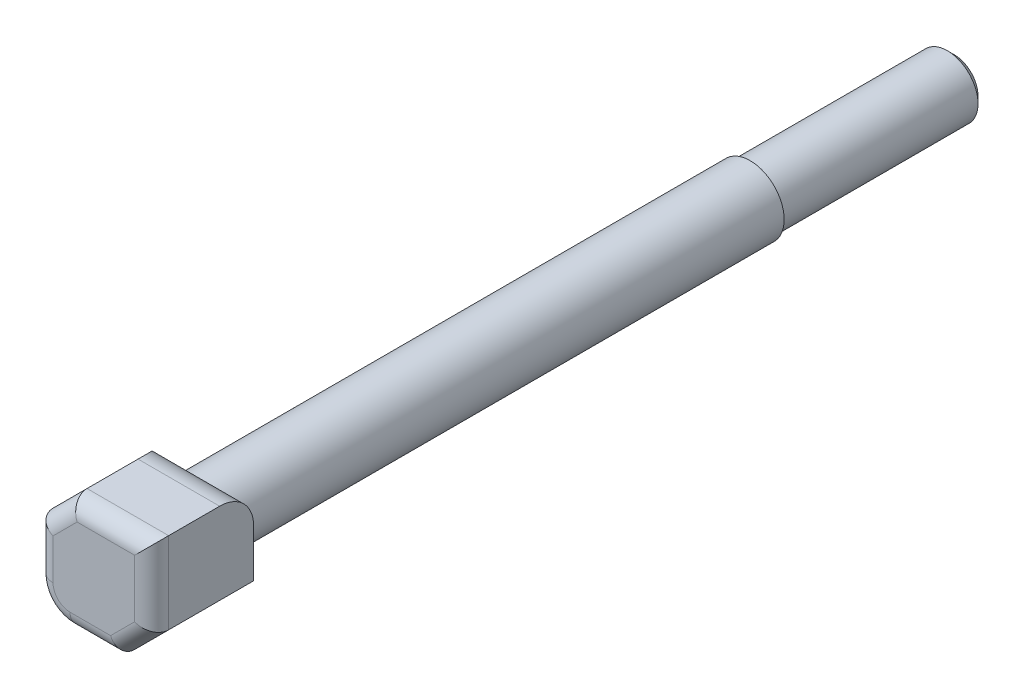
ISO-10303-21;
HEADER;
FILE_DESCRIPTION(('STEP AP214'),'2;1');
FILE_NAME('part.step','',(''),(''),'','','');
FILE_SCHEMA(('AUTOMOTIVE_DESIGN { 1 0 10303 214 1 1 1 1 }'));
ENDSEC;
DATA;
#1=APPLICATION_CONTEXT('core data for automotive mechanical design processes');
#2=APPLICATION_PROTOCOL_DEFINITION('international standard','automotive_design',2000,#1);
#3=PRODUCT_CONTEXT('',#1,'mechanical');
#4=PRODUCT('Part','Part','',(#3));
#5=PRODUCT_RELATED_PRODUCT_CATEGORY('part','',(#4));
#6=PRODUCT_DEFINITION_FORMATION('','',#4);
#7=PRODUCT_DEFINITION_CONTEXT('part definition',#1,'design');
#8=PRODUCT_DEFINITION('design','',#6,#7);
#9=PRODUCT_DEFINITION_SHAPE('','',#8);
#10=(LENGTH_UNIT() NAMED_UNIT(*) SI_UNIT(.MILLI.,.METRE.));
#11=(NAMED_UNIT(*) PLANE_ANGLE_UNIT() SI_UNIT($,.RADIAN.));
#12=(NAMED_UNIT(*) SI_UNIT($,.STERADIAN.) SOLID_ANGLE_UNIT());
#13=UNCERTAINTY_MEASURE_WITH_UNIT(LENGTH_MEASURE(1.E-05),#10,'distance_accuracy_value','');
#14=(GEOMETRIC_REPRESENTATION_CONTEXT(3) GLOBAL_UNCERTAINTY_ASSIGNED_CONTEXT((#13)) GLOBAL_UNIT_ASSIGNED_CONTEXT((#10,
#11,#12)) REPRESENTATION_CONTEXT('',''));
#15=CARTESIAN_POINT('',(0.,0.,0.));
#16=DIRECTION('',(0.,0.,1.));
#17=DIRECTION('',(1.,0.,0.));
#18=AXIS2_PLACEMENT_3D('',#15,#16,#17);
#19=CARTESIAN_POINT('',(2.551290276372,1.9,2.5));
#20=DIRECTION('',(-1.,0.,0.));
#21=DIRECTION('',(0.,0.,1.));
#22=AXIS2_PLACEMENT_3D('',#19,#20,#21);
#23=CYLINDRICAL_SURFACE('',#22,0.5);
#24=CARTESIAN_POINT('',(1.9,1.9,2.5));
#25=DIRECTION('',(-0.707106781186547,0.707106781186547,0.));
#26=DIRECTION('',(-0.707106781186547,-0.707106781186547,0.));
#27=AXIS2_PLACEMENT_3D('',#24,#25,#26);
#28=ELLIPSE('',#27,0.707106781186547,0.5);
#29=CARTESIAN_POINT('',(1.9,1.9,3.));
#30=VERTEX_POINT('',#29);
#31=CARTESIAN_POINT('',(2.4,2.4,2.5));
#32=VERTEX_POINT('',#31);
#33=EDGE_CURVE('E124',#30,#32,#28,.T.);
#34=ORIENTED_EDGE('',*,*,#33,.T.);
#35=DIRECTION('',(1.,0.,0.));
#36=VECTOR('',#35,1.);
#37=CARTESIAN_POINT('',(2.4,2.4,2.5));
#38=LINE('',#37,#36);
#39=CARTESIAN_POINT('',(0.,2.39999999999998,2.5));
#40=VERTEX_POINT('',#39);
#41=EDGE_CURVE('E123',#40,#32,#38,.T.);
#42=ORIENTED_EDGE('',*,*,#41,.F.);
#43=CARTESIAN_POINT('',(0.2071067811865,1.9,2.5));
#44=DIRECTION('',(-0.923879532511287,-0.38268343236509,0.));
#45=DIRECTION('',(-0.38268343236509,0.923879532511287,0.));
#46=AXIS2_PLACEMENT_3D('',#43,#44,#45);
#47=ELLIPSE('',#46,0.541196100146197,0.5);
#48=CARTESIAN_POINT('',(0.207106781186499,1.9,3.));
#49=VERTEX_POINT('',#48);
#50=EDGE_CURVE('E21',#40,#49,#47,.F.);
#51=ORIENTED_EDGE('',*,*,#50,.T.);
#52=DIRECTION('',(-1.,0.,0.));
#53=VECTOR('',#52,1.);
#54=CARTESIAN_POINT('',(2.551290276372,1.9,3.));
#55=LINE('',#54,#53);
#56=EDGE_CURVE('E108',#49,#30,#55,.F.);
#57=ORIENTED_EDGE('',*,*,#56,.T.);
#58=EDGE_LOOP('',(#34,#42,#51,#57));
#59=FACE_BOUND('',#58,.T.);
#60=ADVANCED_FACE('F17',(#59),#23,.T.);
#61=CARTESIAN_POINT('',(0.,0.,-23.));
#62=DIRECTION('',(0.,0.,-1.));
#63=DIRECTION('',(-1.,0.,0.));
#64=AXIS2_PLACEMENT_3D('',#61,#62,#63);
#65=PLANE('',#64);
#66=CARTESIAN_POINT('',(0.,0.,-23.));
#67=DIRECTION('',(0.,0.,-1.));
#68=DIRECTION('',(-1.,0.,0.));
#69=AXIS2_PLACEMENT_3D('',#66,#67,#68);
#70=CIRCLE('',#69,0.700167519004445);
#71=CARTESIAN_POINT('',(-0.700167519004445,0.,-23.));
#72=VERTEX_POINT('',#71);
#73=EDGE_CURVE('E172',#72,#72,#70,.F.);
#74=ORIENTED_EDGE('',*,*,#73,.F.);
#75=EDGE_LOOP('',(#74));
#76=FACE_BOUND('',#75,.T.);
#77=ADVANCED_FACE('F439',(#76),#65,.T.);
#78=CARTESIAN_POINT('',(2.4,2.4,0.));
#79=DIRECTION('',(0.,1.,0.));
#80=DIRECTION('',(0.,0.,1.));
#81=AXIS2_PLACEMENT_3D('',#78,#79,#80);
#82=PLANE('',#81);
#83=DIRECTION('',(0.,0.,1.));
#84=VECTOR('',#83,1.);
#85=CARTESIAN_POINT('',(0.,2.4,0.));
#86=LINE('',#85,#84);
#87=CARTESIAN_POINT('',(0.,2.4,1.));
#88=VERTEX_POINT('',#87);
#89=EDGE_CURVE('E113',#88,#40,#86,.T.);
#90=ORIENTED_EDGE('',*,*,#89,.T.);
#91=ORIENTED_EDGE('',*,*,#41,.T.);
#92=DIRECTION('',(0.,0.,1.));
#93=VECTOR('',#92,1.);
#94=CARTESIAN_POINT('',(2.4,2.4,0.));
#95=LINE('',#94,#93);
#96=CARTESIAN_POINT('',(2.4,2.4,1.));
#97=VERTEX_POINT('',#96);
#98=EDGE_CURVE('E132',#32,#97,#95,.F.);
#99=ORIENTED_EDGE('',*,*,#98,.T.);
#100=DIRECTION('',(1.,0.,0.));
#101=VECTOR('',#100,1.);
#102=CARTESIAN_POINT('',(-1.165104451052,2.4,1.));
#103=LINE('',#102,#101);
#104=EDGE_CURVE('E130',#88,#97,#103,.T.);
#105=ORIENTED_EDGE('',*,*,#104,.F.);
#106=EDGE_LOOP('',(#90,#91,#99,#105));
#107=FACE_BOUND('',#106,.T.);
#108=ADVANCED_FACE('F128',(#107),#82,.T.);
#109=CARTESIAN_POINT('',(1.9,-1.154893134252,2.5));
#110=DIRECTION('',(0.,1.,0.));
#111=DIRECTION('',(0.,0.,1.));
#112=AXIS2_PLACEMENT_3D('',#109,#110,#111);
#113=CYLINDRICAL_SURFACE('',#112,0.5);
#114=ORIENTED_EDGE('',*,*,#33,.F.);
#115=DIRECTION('',(0.,1.,0.));
#116=VECTOR('',#115,1.);
#117=CARTESIAN_POINT('',(1.9,-1.154893134252,3.));
#118=LINE('',#117,#116);
#119=CARTESIAN_POINT('',(1.9,0.2071067811865,3.));
#120=VERTEX_POINT('',#119);
#121=EDGE_CURVE('E136',#30,#120,#118,.F.);
#122=ORIENTED_EDGE('',*,*,#121,.T.);
#123=CARTESIAN_POINT('',(1.9,0.2071067811865,2.5));
#124=DIRECTION('',(0.38268343236509,0.923879532511287,0.));
#125=DIRECTION('',(-0.923879532511287,0.38268343236509,0.));
#126=AXIS2_PLACEMENT_3D('',#123,#124,#125);
#127=ELLIPSE('',#126,0.541196100146197,0.5);
#128=CARTESIAN_POINT('',(2.39999999999998,0.,2.5));
#129=VERTEX_POINT('',#128);
#130=EDGE_CURVE('E126',#120,#129,#127,.T.);
#131=ORIENTED_EDGE('',*,*,#130,.T.);
#132=DIRECTION('',(0.,1.,0.));
#133=VECTOR('',#132,1.);
#134=CARTESIAN_POINT('',(2.4,-1.,2.5));
#135=LINE('',#134,#133);
#136=EDGE_CURVE('E171',#32,#129,#135,.F.);
#137=ORIENTED_EDGE('',*,*,#136,.F.);
#138=EDGE_LOOP('',(#114,#122,#131,#137));
#139=FACE_BOUND('',#138,.T.);
#140=ADVANCED_FACE('F180',(#139),#113,.T.);
#141=CARTESIAN_POINT('',(0.,0.,-22.8000991663748));
#142=DIRECTION('',(0.,0.,1.));
#143=DIRECTION('',(1.,0.,0.));
#144=AXIS2_PLACEMENT_3D('',#141,#142,#143);
#145=CONICAL_SURFACE('',#144,0.900116191530742,0.785517805663236);
#146=CARTESIAN_POINT('',(0.,0.,-22.8002153301061));
#147=DIRECTION('',(0.,0.,1.));
#148=DIRECTION('',(1.,0.,0.));
#149=AXIS2_PLACEMENT_3D('',#146,#147,#148);
#150=CIRCLE('',#149,0.9);
#151=CARTESIAN_POINT('',(0.9,0.,-22.8002153301061));
#152=VERTEX_POINT('',#151);
#153=EDGE_CURVE('E118',#152,#152,#150,.T.);
#154=ORIENTED_EDGE('',*,*,#153,.F.);
#155=EDGE_LOOP('',(#154));
#156=FACE_BOUND('',#155,.T.);
#157=ORIENTED_EDGE('',*,*,#73,.T.);
#158=EDGE_LOOP('',(#157));
#159=FACE_BOUND('',#158,.T.);
#160=ADVANCED_FACE('F413',(#156,#159),#145,.T.);
#161=CARTESIAN_POINT('',(-1.165104451052,1.4,1.));
#162=DIRECTION('',(1.,0.,0.));
#163=DIRECTION('',(0.,0.,-1.));
#164=AXIS2_PLACEMENT_3D('',#161,#162,#163);
#165=CYLINDRICAL_SURFACE('',#164,1.);
#166=ORIENTED_EDGE('',*,*,#104,.T.);
#167=CARTESIAN_POINT('',(2.4,1.4,1.));
#168=DIRECTION('',(1.,0.,0.));
#169=DIRECTION('',(0.,0.,-1.));
#170=AXIS2_PLACEMENT_3D('',#167,#168,#169);
#171=CIRCLE('',#170,1.);
#172=CARTESIAN_POINT('',(2.4,1.4,0.));
#173=VERTEX_POINT('',#172);
#174=EDGE_CURVE('E168',#173,#97,#171,.T.);
#175=ORIENTED_EDGE('',*,*,#174,.F.);
#176=DIRECTION('',(1.,0.,0.));
#177=VECTOR('',#176,1.);
#178=CARTESIAN_POINT('',(0.,1.4,0.));
#179=LINE('',#178,#177);
#180=CARTESIAN_POINT('',(-1.,1.4,0.));
#181=VERTEX_POINT('',#180);
#182=EDGE_CURVE('E163',#173,#181,#179,.F.);
#183=ORIENTED_EDGE('',*,*,#182,.T.);
#184=CARTESIAN_POINT('',(-1.,1.4,1.));
#185=DIRECTION('',(-0.707106781186548,0.707106781186548,0.));
#186=DIRECTION('',(0.707106781186548,0.707106781186548,0.));
#187=AXIS2_PLACEMENT_3D('',#184,#185,#186);
#188=ELLIPSE('',#187,1.41421356237309,1.);
#189=EDGE_CURVE('E119',#88,#181,#188,.T.);
#190=ORIENTED_EDGE('',*,*,#189,.F.);
#191=EDGE_LOOP('',(#166,#175,#183,#190));
#192=FACE_BOUND('',#191,.T.);
#193=ADVANCED_FACE('F204',(#192),#165,.T.);
#194=CARTESIAN_POINT('',(2.4,-1.,0.));
#195=DIRECTION('',(1.,0.,0.));
#196=DIRECTION('',(0.,0.,-1.));
#197=AXIS2_PLACEMENT_3D('',#194,#195,#196);
#198=PLANE('',#197);
#199=ORIENTED_EDGE('',*,*,#98,.F.);
#200=ORIENTED_EDGE('',*,*,#136,.T.);
#201=DIRECTION('',(0.,0.,1.));
#202=VECTOR('',#201,1.);
#203=CARTESIAN_POINT('',(2.4,0.,1.5));
#204=LINE('',#203,#202);
#205=CARTESIAN_POINT('',(2.4,0.,0.));
#206=VERTEX_POINT('',#205);
#207=EDGE_CURVE('E191',#206,#129,#204,.T.);
#208=ORIENTED_EDGE('',*,*,#207,.F.);
#209=DIRECTION('',(0.,1.,0.));
#210=VECTOR('',#209,1.);
#211=CARTESIAN_POINT('',(2.4,0.,0.));
#212=LINE('',#211,#210);
#213=EDGE_CURVE('E198',#206,#173,#212,.T.);
#214=ORIENTED_EDGE('',*,*,#213,.T.);
#215=ORIENTED_EDGE('',*,*,#174,.T.);
#216=EDGE_LOOP('',(#199,#200,#208,#214,#215));
#217=FACE_BOUND('',#216,.T.);
#218=ADVANCED_FACE('F206',(#217),#198,.T.);
#219=CARTESIAN_POINT('',(0.8691217561985,2.562014975012,2.5));
#220=DIRECTION('',(-0.707106781186548,-0.707106781186548,0.));
#221=DIRECTION('',(0.707106781186548,-0.707106781186548,0.));
#222=AXIS2_PLACEMENT_3D('',#219,#220,#221);
#223=CYLINDRICAL_SURFACE('',#222,0.5);
#224=CARTESIAN_POINT('',(-0.5,1.1928932188135,2.5));
#225=DIRECTION('',(-0.38268343236509,-0.923879532511287,0.));
#226=DIRECTION('',(0.923879532511287,-0.38268343236509,0.));
#227=AXIS2_PLACEMENT_3D('',#224,#225,#226);
#228=ELLIPSE('',#227,0.541196100146197,0.5);
#229=CARTESIAN_POINT('',(-0.4999948609111,1.19289472401754,2.99999999998019));
#230=VERTEX_POINT('',#229);
#231=CARTESIAN_POINT('',(-0.999999999999983,1.40000000000002,2.5));
#232=VERTEX_POINT('',#231);
#233=EDGE_CURVE('E158',#230,#232,#228,.T.);
#234=ORIENTED_EDGE('',*,*,#233,.F.);
#235=DIRECTION('',(-0.707106781186297,-0.707106781186797,0.));
#236=VECTOR('',#235,1.);
#237=CARTESIAN_POINT('',(0.2071067811865,1.9,3.));
#238=LINE('',#237,#236);
#239=EDGE_CURVE('E104',#49,#230,#238,.T.);
#240=ORIENTED_EDGE('',*,*,#239,.F.);
#241=ORIENTED_EDGE('',*,*,#50,.F.);
#242=DIRECTION('',(-0.707106781186548,-0.707106781186548,0.));
#243=VECTOR('',#242,1.);
#244=CARTESIAN_POINT('',(-0.5,1.9,2.5));
#245=LINE('',#244,#243);
#246=EDGE_CURVE('E101',#232,#40,#245,.F.);
#247=ORIENTED_EDGE('',*,*,#246,.F.);
#248=EDGE_LOOP('',(#234,#240,#241,#247));
#249=FACE_BOUND('',#248,.T.);
#250=ADVANCED_FACE('F100',(#249),#223,.T.);
#251=CARTESIAN_POINT('',(0.5380000845615,-1.154893134252,2.5));
#252=DIRECTION('',(0.707106781186548,0.707106781186548,0.));
#253=DIRECTION('',(-0.707106781186548,0.707106781186548,0.));
#254=AXIS2_PLACEMENT_3D('',#251,#252,#253);
#255=CYLINDRICAL_SURFACE('',#254,0.5);
#256=CARTESIAN_POINT('',(1.1928932188135,-0.5,2.5));
#257=DIRECTION('',(0.923879532511287,0.38268343236509,0.));
#258=DIRECTION('',(0.38268343236509,-0.923879532511287,0.));
#259=AXIS2_PLACEMENT_3D('',#256,#257,#258);
#260=ELLIPSE('',#259,0.541196100146197,0.5);
#261=CARTESIAN_POINT('',(1.40000000000002,-0.999999999999984,2.5));
#262=VERTEX_POINT('',#261);
#263=CARTESIAN_POINT('',(1.19289321881325,-0.5,3.));
#264=VERTEX_POINT('',#263);
#265=EDGE_CURVE('E151',#262,#264,#260,.F.);
#266=ORIENTED_EDGE('',*,*,#265,.F.);
#267=DIRECTION('',(0.707106781186548,0.707106781186548,0.));
#268=VECTOR('',#267,1.);
#269=CARTESIAN_POINT('',(1.9,-0.5,2.5));
#270=LINE('',#269,#268);
#271=EDGE_CURVE('E160',#129,#262,#270,.F.);
#272=ORIENTED_EDGE('',*,*,#271,.F.);
#273=ORIENTED_EDGE('',*,*,#130,.F.);
#274=DIRECTION('',(0.707106781186797,0.707106781186297,0.));
#275=VECTOR('',#274,1.);
#276=CARTESIAN_POINT('',(1.192893218813,-0.5,3.));
#277=LINE('',#276,#275);
#278=EDGE_CURVE('E165',#264,#120,#277,.T.);
#279=ORIENTED_EDGE('',*,*,#278,.F.);
#280=EDGE_LOOP('',(#266,#272,#273,#279));
#281=FACE_BOUND('',#280,.T.);
#282=ADVANCED_FACE('F271',(#281),#255,.T.);
#283=CARTESIAN_POINT('',(0.,0.,3.));
#284=DIRECTION('',(0.,0.,1.));
#285=DIRECTION('',(1.,0.,0.));
#286=AXIS2_PLACEMENT_3D('',#283,#284,#285);
#287=PLANE('',#286);
#288=DIRECTION('',(1.,0.,0.));
#289=VECTOR('',#288,1.);
#290=CARTESIAN_POINT('',(-1.165104451052,-0.5,3.));
#291=LINE('',#290,#289);
#292=CARTESIAN_POINT('',(7.66654209734263E-10,-0.5,3.00000000000037));
#293=VERTEX_POINT('',#292);
#294=EDGE_CURVE('E154',#264,#293,#291,.F.);
#295=ORIENTED_EDGE('',*,*,#294,.F.);
#296=ORIENTED_EDGE('',*,*,#278,.T.);
#297=ORIENTED_EDGE('',*,*,#121,.F.);
#298=ORIENTED_EDGE('',*,*,#56,.F.);
#299=ORIENTED_EDGE('',*,*,#239,.T.);
#300=DIRECTION('',(0.,-1.,0.));
#301=VECTOR('',#300,1.);
#302=CARTESIAN_POINT('',(-0.4999948609111,2.562014975012,2.99999999997359));
#303=LINE('',#302,#301);
#304=CARTESIAN_POINT('',(-0.499997430454884,0.,2.99999999998716));
#305=VERTEX_POINT('',#304);
#306=EDGE_CURVE('E155',#305,#230,#303,.F.);
#307=ORIENTED_EDGE('',*,*,#306,.F.);
#308=CARTESIAN_POINT('',(7.86913936789979E-13,-7.8296878644908E-13,3.00000000000074));
#309=DIRECTION('',(0.,0.,1.));
#310=DIRECTION('',(1.,0.,0.));
#311=AXIS2_PLACEMENT_3D('',#308,#309,#310);
#312=CIRCLE('',#311,0.499999999999217);
#313=EDGE_CURVE('E166',#305,#293,#312,.T.);
#314=ORIENTED_EDGE('',*,*,#313,.T.);
#315=EDGE_LOOP('',(#295,#296,#297,#298,#299,#307,#314));
#316=FACE_BOUND('',#315,.T.);
#317=ADVANCED_FACE('F185',(#316),#287,.T.);
#318=CARTESIAN_POINT('',(-0.5,1.9,1.5));
#319=DIRECTION('',(-0.707106781186548,0.707106781186548,0.));
#320=DIRECTION('',(-0.707106781186548,-0.707106781186548,0.));
#321=AXIS2_PLACEMENT_3D('',#318,#319,#320);
#322=PLANE('',#321);
#323=DIRECTION('',(0.,0.,1.));
#324=VECTOR('',#323,1.);
#325=CARTESIAN_POINT('',(-1.,1.4,0.));
#326=LINE('',#325,#324);
#327=EDGE_CURVE('E116',#232,#181,#326,.F.);
#328=ORIENTED_EDGE('',*,*,#327,.F.);
#329=ORIENTED_EDGE('',*,*,#246,.T.);
#330=ORIENTED_EDGE('',*,*,#89,.F.);
#331=ORIENTED_EDGE('',*,*,#189,.T.);
#332=EDGE_LOOP('',(#328,#329,#330,#331));
#333=FACE_BOUND('',#332,.T.);
#334=ADVANCED_FACE('F110',(#333),#322,.T.);
#335=CARTESIAN_POINT('',(0.,0.,-17.));
#336=DIRECTION('',(0.,0.,-1.));
#337=DIRECTION('',(-1.,0.,0.));
#338=AXIS2_PLACEMENT_3D('',#335,#336,#337);
#339=CYLINDRICAL_SURFACE('',#338,0.9);
#340=CARTESIAN_POINT('',(0.,0.,-17.));
#341=DIRECTION('',(0.,0.,-1.));
#342=DIRECTION('',(-1.,0.,0.));
#343=AXIS2_PLACEMENT_3D('',#340,#341,#342);
#344=CIRCLE('',#343,0.9);
#345=CARTESIAN_POINT('',(-0.9,0.,-17.));
#346=VERTEX_POINT('',#345);
#347=EDGE_CURVE('E147',#346,#346,#344,.T.);
#348=ORIENTED_EDGE('',*,*,#347,.T.);
#349=EDGE_LOOP('',(#348));
#350=FACE_BOUND('',#349,.T.);
#351=ORIENTED_EDGE('',*,*,#153,.T.);
#352=EDGE_LOOP('',(#351));
#353=FACE_BOUND('',#352,.T.);
#354=ADVANCED_FACE('F355',(#350,#353),#339,.T.);
#355=CARTESIAN_POINT('',(0.,0.,0.));
#356=DIRECTION('',(0.,0.,1.));
#357=DIRECTION('',(1.,0.,0.));
#358=AXIS2_PLACEMENT_3D('',#355,#356,#357);
#359=PLANE('',#358);
#360=DIRECTION('',(0.707106781186548,0.707106781186548,0.));
#361=VECTOR('',#360,1.);
#362=CARTESIAN_POINT('',(1.9,-0.5,0.));
#363=LINE('',#362,#361);
#364=CARTESIAN_POINT('',(1.4,-1.,0.));
#365=VERTEX_POINT('',#364);
#366=EDGE_CURVE('E194',#365,#206,#363,.T.);
#367=ORIENTED_EDGE('',*,*,#366,.F.);
#368=DIRECTION('',(1.,0.,0.));
#369=VECTOR('',#368,1.);
#370=CARTESIAN_POINT('',(0.,-1.,0.));
#371=LINE('',#370,#369);
#372=CARTESIAN_POINT('',(0.,-1.,0.));
#373=VERTEX_POINT('',#372);
#374=EDGE_CURVE('E201',#373,#365,#371,.T.);
#375=ORIENTED_EDGE('',*,*,#374,.F.);
#376=CARTESIAN_POINT('',(0.,0.,0.));
#377=DIRECTION('',(0.,0.,1.));
#378=DIRECTION('',(1.,0.,0.));
#379=AXIS2_PLACEMENT_3D('',#376,#377,#378);
#380=CIRCLE('',#379,1.);
#381=CARTESIAN_POINT('',(-1.,0.,0.));
#382=VERTEX_POINT('',#381);
#383=EDGE_CURVE('E144',#382,#373,#380,.F.);
#384=ORIENTED_EDGE('',*,*,#383,.F.);
#385=DIRECTION('',(0.,1.,0.));
#386=VECTOR('',#385,1.);
#387=CARTESIAN_POINT('',(-1.,2.4,0.));
#388=LINE('',#387,#386);
#389=EDGE_CURVE('E215',#181,#382,#388,.F.);
#390=ORIENTED_EDGE('',*,*,#389,.F.);
#391=ORIENTED_EDGE('',*,*,#182,.F.);
#392=ORIENTED_EDGE('',*,*,#213,.F.);
#393=EDGE_LOOP('',(#367,#375,#384,#390,#391,#392));
#394=FACE_BOUND('',#393,.T.);
#395=ADVANCED_FACE('F213',(#394),#359,.F.);
#396=CARTESIAN_POINT('',(1.9,-0.5,1.5));
#397=DIRECTION('',(0.707106781186548,-0.707106781186548,0.));
#398=DIRECTION('',(0.707106781186548,0.707106781186548,0.));
#399=AXIS2_PLACEMENT_3D('',#396,#397,#398);
#400=PLANE('',#399);
#401=ORIENTED_EDGE('',*,*,#207,.T.);
#402=ORIENTED_EDGE('',*,*,#271,.T.);
#403=DIRECTION('',(0.,0.,-1.));
#404=VECTOR('',#403,1.);
#405=CARTESIAN_POINT('',(1.4,-1.,0.));
#406=LINE('',#405,#404);
#407=EDGE_CURVE('E146',#365,#262,#406,.F.);
#408=ORIENTED_EDGE('',*,*,#407,.F.);
#409=ORIENTED_EDGE('',*,*,#366,.T.);
#410=EDGE_LOOP('',(#401,#402,#408,#409));
#411=FACE_BOUND('',#410,.T.);
#412=ADVANCED_FACE('F274',(#411),#400,.T.);
#413=CARTESIAN_POINT('',(-0.5,2.562014975012,2.5));
#414=DIRECTION('',(0.,-1.,0.));
#415=DIRECTION('',(0.,0.,-1.));
#416=AXIS2_PLACEMENT_3D('',#413,#414,#415);
#417=CYLINDRICAL_SURFACE('',#416,0.5);
#418=CARTESIAN_POINT('',(-0.499999999998905,0.,2.5));
#419=DIRECTION('',(0.,-1.,0.));
#420=DIRECTION('',(1.,0.,0.));
#421=AXIS2_PLACEMENT_3D('',#418,#419,#420);
#422=CIRCLE('',#421,0.500000000000739);
#423=CARTESIAN_POINT('',(-0.999999999999911,0.,2.5));
#424=VERTEX_POINT('',#423);
#425=EDGE_CURVE('E233',#305,#424,#422,.T.);
#426=ORIENTED_EDGE('',*,*,#425,.F.);
#427=ORIENTED_EDGE('',*,*,#306,.T.);
#428=ORIENTED_EDGE('',*,*,#233,.T.);
#429=DIRECTION('',(0.,1.,0.));
#430=VECTOR('',#429,1.);
#431=CARTESIAN_POINT('',(-1.,2.4,2.5));
#432=LINE('',#431,#430);
#433=EDGE_CURVE('E150',#424,#232,#432,.T.);
#434=ORIENTED_EDGE('',*,*,#433,.F.);
#435=EDGE_LOOP('',(#426,#427,#428,#434));
#436=FACE_BOUND('',#435,.T.);
#437=ADVANCED_FACE('F268',(#436),#417,.T.);
#438=CARTESIAN_POINT('',(-1.165104451052,-0.5,2.5));
#439=DIRECTION('',(1.,0.,0.));
#440=DIRECTION('',(0.,0.,-1.));
#441=AXIS2_PLACEMENT_3D('',#438,#439,#440);
#442=CYLINDRICAL_SURFACE('',#441,0.5);
#443=CARTESIAN_POINT('',(1.53252155788843E-09,-0.499999999998901,2.5));
#444=DIRECTION('',(-1.,-3.06504308273819E-09,0.));
#445=DIRECTION('',(3.06504308273819E-09,-1.,0.));
#446=AXIS2_PLACEMENT_3D('',#443,#444,#445);
#447=CIRCLE('',#446,0.500000000000735);
#448=CARTESIAN_POINT('',(8.62043443344421E-10,-1.,2.5));
#449=VERTEX_POINT('',#448);
#450=EDGE_CURVE('E36',#449,#293,#447,.T.);
#451=ORIENTED_EDGE('',*,*,#450,.F.);
#452=DIRECTION('',(1.,0.,0.));
#453=VECTOR('',#452,1.);
#454=CARTESIAN_POINT('',(-1.,-1.,2.5));
#455=LINE('',#454,#453);
#456=EDGE_CURVE('E236',#262,#449,#455,.F.);
#457=ORIENTED_EDGE('',*,*,#456,.F.);
#458=ORIENTED_EDGE('',*,*,#265,.T.);
#459=ORIENTED_EDGE('',*,*,#294,.T.);
#460=EDGE_LOOP('',(#451,#457,#458,#459));
#461=FACE_BOUND('',#460,.T.);
#462=ADVANCED_FACE('F269',(#461),#442,.T.);
#463=CARTESIAN_POINT('',(-1.,2.4,0.));
#464=DIRECTION('',(-1.,0.,0.));
#465=DIRECTION('',(0.,0.,1.));
#466=AXIS2_PLACEMENT_3D('',#463,#464,#465);
#467=PLANE('',#466);
#468=DIRECTION('',(0.,0.,1.));
#469=VECTOR('',#468,1.);
#470=CARTESIAN_POINT('',(-1.,0.,0.));
#471=LINE('',#470,#469);
#472=EDGE_CURVE('E143',#424,#382,#471,.F.);
#473=ORIENTED_EDGE('',*,*,#472,.F.);
#474=ORIENTED_EDGE('',*,*,#433,.T.);
#475=ORIENTED_EDGE('',*,*,#327,.T.);
#476=ORIENTED_EDGE('',*,*,#389,.T.);
#477=EDGE_LOOP('',(#473,#474,#475,#476));
#478=FACE_BOUND('',#477,.T.);
#479=ADVANCED_FACE('F263',(#478),#467,.T.);
#480=CARTESIAN_POINT('',(0.,0.,-17.));
#481=DIRECTION('',(0.,0.,1.));
#482=DIRECTION('',(1.,0.,0.));
#483=AXIS2_PLACEMENT_3D('',#480,#481,#482);
#484=PLANE('',#483);
#485=ORIENTED_EDGE('',*,*,#347,.F.);
#486=EDGE_LOOP('',(#485));
#487=FACE_BOUND('',#486,.T.);
#488=CARTESIAN_POINT('',(0.,0.,-17.));
#489=DIRECTION('',(0.,0.,1.));
#490=DIRECTION('',(1.,0.,0.));
#491=AXIS2_PLACEMENT_3D('',#488,#489,#490);
#492=CIRCLE('',#491,1.);
#493=CARTESIAN_POINT('',(1.,0.,-17.));
#494=VERTEX_POINT('',#493);
#495=EDGE_CURVE('E140',#494,#494,#492,.T.);
#496=ORIENTED_EDGE('',*,*,#495,.F.);
#497=EDGE_LOOP('',(#496));
#498=FACE_BOUND('',#497,.T.);
#499=ADVANCED_FACE('F279',(#487,#498),#484,.F.);
#500=CARTESIAN_POINT('',(-1.,-1.,0.));
#501=DIRECTION('',(0.,-1.,0.));
#502=DIRECTION('',(0.,0.,-1.));
#503=AXIS2_PLACEMENT_3D('',#500,#501,#502);
#504=PLANE('',#503);
#505=ORIENTED_EDGE('',*,*,#407,.T.);
#506=ORIENTED_EDGE('',*,*,#456,.T.);
#507=DIRECTION('',(0.,0.,1.));
#508=VECTOR('',#507,1.);
#509=CARTESIAN_POINT('',(0.,-1.,0.));
#510=LINE('',#509,#508);
#511=EDGE_CURVE('E27',#373,#449,#510,.T.);
#512=ORIENTED_EDGE('',*,*,#511,.F.);
#513=ORIENTED_EDGE('',*,*,#374,.T.);
#514=EDGE_LOOP('',(#505,#506,#512,#513));
#515=FACE_BOUND('',#514,.T.);
#516=ADVANCED_FACE('F277',(#515),#504,.T.);
#517=CARTESIAN_POINT('',(7.86913936789979E-13,-7.8296878644908E-13,2.5));
#518=DIRECTION('',(0.,0.,1.));
#519=DIRECTION('',(1.,0.,0.));
#520=AXIS2_PLACEMENT_3D('',#517,#518,#519);
#521=DEGENERATE_TOROIDAL_SURFACE('',#520,0.499999999999694,0.500000000000738,.T.);
#522=ORIENTED_EDGE('',*,*,#450,.T.);
#523=ORIENTED_EDGE('',*,*,#313,.F.);
#524=ORIENTED_EDGE('',*,*,#425,.T.);
#525=CARTESIAN_POINT('',(0.,0.,2.5));
#526=DIRECTION('',(0.,0.,1.));
#527=DIRECTION('',(1.,0.,0.));
#528=AXIS2_PLACEMENT_3D('',#525,#526,#527);
#529=CIRCLE('',#528,1.);
#530=EDGE_CURVE('E11',#449,#424,#529,.F.);
#531=ORIENTED_EDGE('',*,*,#530,.F.);
#532=EDGE_LOOP('',(#522,#523,#524,#531));
#533=FACE_BOUND('',#532,.T.);
#534=ADVANCED_FACE('F19',(#533),#521,.T.);
#535=CARTESIAN_POINT('',(0.,0.,0.));
#536=DIRECTION('',(0.,0.,1.));
#537=DIRECTION('',(1.,0.,0.));
#538=AXIS2_PLACEMENT_3D('',#535,#536,#537);
#539=CYLINDRICAL_SURFACE('',#538,1.);
#540=ORIENTED_EDGE('',*,*,#495,.T.);
#541=EDGE_LOOP('',(#540));
#542=FACE_BOUND('',#541,.T.);
#543=ORIENTED_EDGE('',*,*,#511,.T.);
#544=ORIENTED_EDGE('',*,*,#530,.T.);
#545=ORIENTED_EDGE('',*,*,#472,.T.);
#546=ORIENTED_EDGE('',*,*,#383,.T.);
#547=EDGE_LOOP('',(#543,#544,#545,#546));
#548=FACE_BOUND('',#547,.T.);
#549=ADVANCED_FACE('F259',(#542,#548),#539,.T.);
#550=CLOSED_SHELL('',(#60,#77,#108,#140,#160,#193,#218,#250,#282,#317,#334,#354,#395,#412,#437,
#462,#479,#499,#516,#534,#549));
#551=MANIFOLD_SOLID_BREP('B1',#550);
#552=ADVANCED_BREP_SHAPE_REPRESENTATION('',(#18,#551),#14);
#553=SHAPE_DEFINITION_REPRESENTATION(#9,#552);
ENDSEC;
END-ISO-10303-21;
